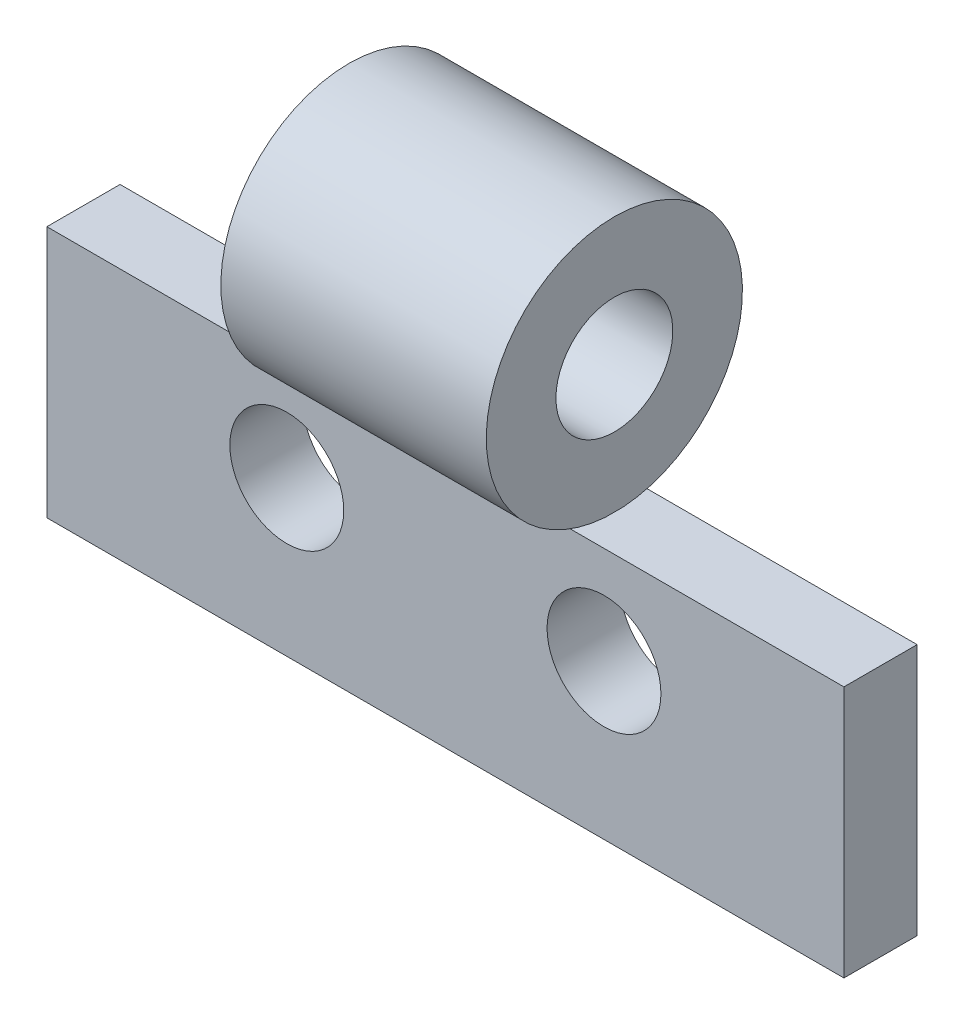
ISO-10303-21;
HEADER;
FILE_DESCRIPTION(('STEP AP214'),'2;1');
FILE_NAME('part.step','',(''),(''),'','','');
FILE_SCHEMA(('AUTOMOTIVE_DESIGN { 1 0 10303 214 1 1 1 1 }'));
ENDSEC;
DATA;
#1=APPLICATION_CONTEXT('core data for automotive mechanical design processes');
#2=APPLICATION_PROTOCOL_DEFINITION('international standard','automotive_design',2000,#1);
#3=PRODUCT_CONTEXT('',#1,'mechanical');
#4=PRODUCT('Part','Part','',(#3));
#5=PRODUCT_RELATED_PRODUCT_CATEGORY('part','',(#4));
#6=PRODUCT_DEFINITION_FORMATION('','',#4);
#7=PRODUCT_DEFINITION_CONTEXT('part definition',#1,'design');
#8=PRODUCT_DEFINITION('design','',#6,#7);
#9=PRODUCT_DEFINITION_SHAPE('','',#8);
#10=(LENGTH_UNIT() NAMED_UNIT(*) SI_UNIT(.MILLI.,.METRE.));
#11=(NAMED_UNIT(*) PLANE_ANGLE_UNIT() SI_UNIT($,.RADIAN.));
#12=(NAMED_UNIT(*) SI_UNIT($,.STERADIAN.) SOLID_ANGLE_UNIT());
#13=UNCERTAINTY_MEASURE_WITH_UNIT(LENGTH_MEASURE(1.E-05),#10,'distance_accuracy_value','');
#14=(GEOMETRIC_REPRESENTATION_CONTEXT(3) GLOBAL_UNCERTAINTY_ASSIGNED_CONTEXT((#13)) GLOBAL_UNIT_ASSIGNED_CONTEXT((#10,
#11,#12)) REPRESENTATION_CONTEXT('',''));
#15=CARTESIAN_POINT('',(0.,0.,0.));
#16=DIRECTION('',(0.,0.,1.));
#17=DIRECTION('',(1.,0.,0.));
#18=AXIS2_PLACEMENT_3D('',#15,#16,#17);
#19=CARTESIAN_POINT('',(-24.27796875,7.59378125,2.286));
#20=DIRECTION('',(1.,0.,0.));
#21=DIRECTION('',(0.,0.,-1.));
#22=AXIS2_PLACEMENT_3D('',#19,#20,#21);
#23=PLANE('',#22);
#24=DIRECTION('',(0.,0.,-1.));
#25=VECTOR('',#24,1.);
#26=CARTESIAN_POINT('',(-24.27796875,7.59378125,2.286));
#27=LINE('',#26,#25);
#28=CARTESIAN_POINT('',(-24.27796875,7.59378125,2.286));
#29=VERTEX_POINT('',#28);
#30=CARTESIAN_POINT('',(-24.27796875,7.59378125,0.));
#31=VERTEX_POINT('',#30);
#32=EDGE_CURVE('E55',#29,#31,#27,.T.);
#33=ORIENTED_EDGE('',*,*,#32,.T.);
#34=DIRECTION('',(0.,-1.,0.));
#35=VECTOR('',#34,1.);
#36=CARTESIAN_POINT('',(-24.27796875,7.59378125,0.));
#37=LINE('',#36,#35);
#38=CARTESIAN_POINT('',(-24.27796875,-0.28021875,0.));
#39=VERTEX_POINT('',#38);
#40=EDGE_CURVE('E108',#31,#39,#37,.T.);
#41=ORIENTED_EDGE('',*,*,#40,.T.);
#42=DIRECTION('',(0.,0.,-1.));
#43=VECTOR('',#42,1.);
#44=CARTESIAN_POINT('',(-24.27796875,-0.28021875,2.286));
#45=LINE('',#44,#43);
#46=CARTESIAN_POINT('',(-24.27796875,-0.28021875,2.286));
#47=VERTEX_POINT('',#46);
#48=EDGE_CURVE('E136',#47,#39,#45,.T.);
#49=ORIENTED_EDGE('',*,*,#48,.F.);
#50=DIRECTION('',(0.,-1.,0.));
#51=VECTOR('',#50,1.);
#52=CARTESIAN_POINT('',(-24.27796875,7.59378125,2.286));
#53=LINE('',#52,#51);
#54=EDGE_CURVE('E115',#29,#47,#53,.T.);
#55=ORIENTED_EDGE('',*,*,#54,.F.);
#56=EDGE_LOOP('',(#33,#41,#49,#55));
#57=FACE_BOUND('',#56,.T.);
#58=ADVANCED_FACE('F32',(#57),#23,.F.);
#59=CARTESIAN_POINT('',(-24.27796875,-0.28021875,2.286));
#60=DIRECTION('',(0.,1.,0.));
#61=DIRECTION('',(0.,0.,1.));
#62=AXIS2_PLACEMENT_3D('',#59,#60,#61);
#63=PLANE('',#62);
#64=DIRECTION('',(1.,0.,0.));
#65=VECTOR('',#64,1.);
#66=CARTESIAN_POINT('',(-24.27796875,-0.28021875,0.));
#67=LINE('',#66,#65);
#68=CARTESIAN_POINT('',(0.61403125,-0.28021875,0.));
#69=VERTEX_POINT('',#68);
#70=EDGE_CURVE('E110',#39,#69,#67,.T.);
#71=ORIENTED_EDGE('',*,*,#70,.T.);
#72=DIRECTION('',(0.,0.,-1.));
#73=VECTOR('',#72,1.);
#74=CARTESIAN_POINT('',(0.61403125,-0.28021875,2.286));
#75=LINE('',#74,#73);
#76=CARTESIAN_POINT('',(0.61403125,-0.28021875,2.286));
#77=VERTEX_POINT('',#76);
#78=EDGE_CURVE('E134',#77,#69,#75,.T.);
#79=ORIENTED_EDGE('',*,*,#78,.F.);
#80=DIRECTION('',(1.,0.,0.));
#81=VECTOR('',#80,1.);
#82=CARTESIAN_POINT('',(-24.27796875,-0.28021875,2.286));
#83=LINE('',#82,#81);
#84=EDGE_CURVE('E81',#47,#77,#83,.T.);
#85=ORIENTED_EDGE('',*,*,#84,.F.);
#86=ORIENTED_EDGE('',*,*,#48,.T.);
#87=EDGE_LOOP('',(#71,#79,#85,#86));
#88=FACE_BOUND('',#87,.T.);
#89=ADVANCED_FACE('F154',(#88),#63,.F.);
#90=CARTESIAN_POINT('',(0.614031249999999,7.59378125,2.286));
#91=DIRECTION('',(1.,0.,0.));
#92=DIRECTION('',(0.,1.,0.));
#93=AXIS2_PLACEMENT_3D('',#90,#91,#92);
#94=PLANE('',#93);
#95=DIRECTION('',(0.,-1.,0.));
#96=VECTOR('',#95,1.);
#97=CARTESIAN_POINT('',(0.614031249999999,7.59378125,0.));
#98=LINE('',#97,#96);
#99=CARTESIAN_POINT('',(0.614031249999999,7.59378125,0.));
#100=VERTEX_POINT('',#99);
#101=EDGE_CURVE('E126',#100,#69,#98,.T.);
#102=ORIENTED_EDGE('',*,*,#101,.F.);
#103=DIRECTION('',(0.,0.,-1.));
#104=VECTOR('',#103,1.);
#105=CARTESIAN_POINT('',(0.614031249999999,7.59378125,2.286));
#106=LINE('',#105,#104);
#107=CARTESIAN_POINT('',(0.614031249999999,7.59378125,2.286));
#108=VERTEX_POINT('',#107);
#109=EDGE_CURVE('E131',#108,#100,#106,.T.);
#110=ORIENTED_EDGE('',*,*,#109,.F.);
#111=DIRECTION('',(0.,-1.,0.));
#112=VECTOR('',#111,1.);
#113=CARTESIAN_POINT('',(0.614031249999999,7.59378125,2.286));
#114=LINE('',#113,#112);
#115=EDGE_CURVE('E119',#108,#77,#114,.T.);
#116=ORIENTED_EDGE('',*,*,#115,.T.);
#117=ORIENTED_EDGE('',*,*,#78,.T.);
#118=EDGE_LOOP('',(#102,#110,#116,#117));
#119=FACE_BOUND('',#118,.T.);
#120=ADVANCED_FACE('F158',(#119),#94,.T.);
#121=CARTESIAN_POINT('',(-24.27796875,7.59378125,2.286));
#122=DIRECTION('',(0.,1.,0.));
#123=DIRECTION('',(-1.,0.,0.));
#124=AXIS2_PLACEMENT_3D('',#121,#122,#123);
#125=PLANE('',#124);
#126=DIRECTION('',(-1.,0.,0.));
#127=VECTOR('',#126,1.);
#128=CARTESIAN_POINT('',(-7.69796875,7.59378125,1.42566588050203));
#129=LINE('',#128,#127);
#130=CARTESIAN_POINT('',(-15.98796875,7.59378125,1.42566588050203));
#131=VERTEX_POINT('',#130);
#132=CARTESIAN_POINT('',(-7.69796875,7.59378125,1.42566588050203));
#133=VERTEX_POINT('',#132);
#134=EDGE_CURVE('E40',#131,#133,#129,.F.);
#135=ORIENTED_EDGE('',*,*,#134,.F.);
#136=DIRECTION('',(0.,0.,-1.));
#137=VECTOR('',#136,1.);
#138=CARTESIAN_POINT('',(-15.98796875,7.59378125,9.57083423816485));
#139=LINE('',#138,#137);
#140=CARTESIAN_POINT('',(-15.98796875,7.59378125,0.860334119497956));
#141=VERTEX_POINT('',#140);
#142=EDGE_CURVE('E46',#131,#141,#139,.T.);
#143=ORIENTED_EDGE('',*,*,#142,.T.);
#144=DIRECTION('',(-1.,0.,0.));
#145=VECTOR('',#144,1.);
#146=CARTESIAN_POINT('',(-7.69796875,7.59378125,0.860334119497968));
#147=LINE('',#146,#145);
#148=CARTESIAN_POINT('',(-7.69796875,7.59378125,0.860334119497968));
#149=VERTEX_POINT('',#148);
#150=EDGE_CURVE('E11',#149,#141,#147,.T.);
#151=ORIENTED_EDGE('',*,*,#150,.F.);
#152=DIRECTION('',(0.,0.,1.));
#153=VECTOR('',#152,1.);
#154=CARTESIAN_POINT('',(-7.69796875,7.59378125,2.286));
#155=LINE('',#154,#153);
#156=EDGE_CURVE('E138',#149,#133,#155,.T.);
#157=ORIENTED_EDGE('',*,*,#156,.T.);
#158=EDGE_LOOP('',(#135,#143,#151,#157));
#159=FACE_BOUND('',#158,.T.);
#160=DIRECTION('',(1.,0.,0.));
#161=VECTOR('',#160,1.);
#162=CARTESIAN_POINT('',(-24.27796875,7.59378125,2.286));
#163=LINE('',#162,#161);
#164=EDGE_CURVE('E122',#29,#108,#163,.T.);
#165=ORIENTED_EDGE('',*,*,#164,.T.);
#166=ORIENTED_EDGE('',*,*,#109,.T.);
#167=DIRECTION('',(1.,0.,0.));
#168=VECTOR('',#167,1.);
#169=CARTESIAN_POINT('',(-24.27796875,7.59378125,0.));
#170=LINE('',#169,#168);
#171=EDGE_CURVE('E117',#31,#100,#170,.T.);
#172=ORIENTED_EDGE('',*,*,#171,.F.);
#173=ORIENTED_EDGE('',*,*,#32,.F.);
#174=EDGE_LOOP('',(#165,#166,#172,#173));
#175=FACE_BOUND('',#174,.T.);
#176=ADVANCED_FACE('F99',(#159,#175),#125,.T.);
#177=CARTESIAN_POINT('',(0.,0.,2.286));
#178=DIRECTION('',(0.,0.,1.));
#179=DIRECTION('',(1.,0.,0.));
#180=AXIS2_PLACEMENT_3D('',#177,#178,#179);
#181=PLANE('',#180);
#182=CARTESIAN_POINT('',(-16.78496875,4.54578125,2.286));
#183=DIRECTION('',(0.,0.,1.));
#184=DIRECTION('',(1.,0.,0.));
#185=AXIS2_PLACEMENT_3D('',#182,#183,#184);
#186=CIRCLE('',#185,1.778);
#187=CARTESIAN_POINT('',(-15.00696875,4.54578125,2.286));
#188=VERTEX_POINT('',#187);
#189=EDGE_CURVE('E178',#188,#188,#186,.T.);
#190=ORIENTED_EDGE('',*,*,#189,.F.);
#191=EDGE_LOOP('',(#190));
#192=FACE_BOUND('',#191,.T.);
#193=CARTESIAN_POINT('',(-6.87896875,4.54578125,2.286));
#194=DIRECTION('',(0.,0.,1.));
#195=DIRECTION('',(1.,0.,0.));
#196=AXIS2_PLACEMENT_3D('',#193,#194,#195);
#197=CIRCLE('',#196,1.778);
#198=CARTESIAN_POINT('',(-5.10096875,4.54578125,2.286));
#199=VERTEX_POINT('',#198);
#200=EDGE_CURVE('E101',#199,#199,#197,.T.);
#201=ORIENTED_EDGE('',*,*,#200,.F.);
#202=EDGE_LOOP('',(#201));
#203=FACE_BOUND('',#202,.T.);
#204=ORIENTED_EDGE('',*,*,#54,.T.);
#205=ORIENTED_EDGE('',*,*,#84,.T.);
#206=ORIENTED_EDGE('',*,*,#115,.F.);
#207=ORIENTED_EDGE('',*,*,#164,.F.);
#208=EDGE_LOOP('',(#204,#205,#206,#207));
#209=FACE_BOUND('',#208,.T.);
#210=ADVANCED_FACE('F167',(#192,#203,#209),#181,.T.);
#211=CARTESIAN_POINT('',(0.,0.,0.));
#212=DIRECTION('',(0.,0.,1.));
#213=DIRECTION('',(1.,0.,0.));
#214=AXIS2_PLACEMENT_3D('',#211,#212,#213);
#215=PLANE('',#214);
#216=CARTESIAN_POINT('',(-16.78496875,4.54578125,0.));
#217=DIRECTION('',(0.,0.,-1.));
#218=DIRECTION('',(-1.,0.,0.));
#219=AXIS2_PLACEMENT_3D('',#216,#217,#218);
#220=CIRCLE('',#219,1.778);
#221=CARTESIAN_POINT('',(-18.56296875,4.54578125,0.));
#222=VERTEX_POINT('',#221);
#223=EDGE_CURVE('E195',#222,#222,#220,.T.);
#224=ORIENTED_EDGE('',*,*,#223,.F.);
#225=EDGE_LOOP('',(#224));
#226=FACE_BOUND('',#225,.T.);
#227=CARTESIAN_POINT('',(-6.87896875,4.54578125,0.));
#228=DIRECTION('',(0.,0.,-1.));
#229=DIRECTION('',(-1.,0.,0.));
#230=AXIS2_PLACEMENT_3D('',#227,#228,#229);
#231=CIRCLE('',#230,1.778);
#232=CARTESIAN_POINT('',(-8.65696875,4.54578125,0.));
#233=VERTEX_POINT('',#232);
#234=EDGE_CURVE('E189',#233,#233,#231,.T.);
#235=ORIENTED_EDGE('',*,*,#234,.F.);
#236=EDGE_LOOP('',(#235));
#237=FACE_BOUND('',#236,.T.);
#238=ORIENTED_EDGE('',*,*,#40,.F.);
#239=ORIENTED_EDGE('',*,*,#171,.T.);
#240=ORIENTED_EDGE('',*,*,#101,.T.);
#241=ORIENTED_EDGE('',*,*,#70,.F.);
#242=EDGE_LOOP('',(#238,#239,#240,#241));
#243=FACE_BOUND('',#242,.T.);
#244=ADVANCED_FACE('F151',(#226,#237,#243),#215,.F.);
#245=CARTESIAN_POINT('',(-7.69796875,11.58378125,1.143));
#246=DIRECTION('',(-1.,0.,0.));
#247=DIRECTION('',(0.,0.,1.));
#248=AXIS2_PLACEMENT_3D('',#245,#246,#247);
#249=CYLINDRICAL_SURFACE('',#248,4.);
#250=CARTESIAN_POINT('',(-15.98796875,11.58378125,1.143));
#251=DIRECTION('',(1.,0.,0.));
#252=DIRECTION('',(0.,0.,-1.));
#253=AXIS2_PLACEMENT_3D('',#250,#251,#252);
#254=CIRCLE('',#253,4.);
#255=EDGE_CURVE('E90',#131,#141,#254,.F.);
#256=ORIENTED_EDGE('',*,*,#255,.F.);
#257=ORIENTED_EDGE('',*,*,#134,.T.);
#258=CARTESIAN_POINT('',(-7.69796875,11.58378125,1.143));
#259=DIRECTION('',(-1.,0.,0.));
#260=DIRECTION('',(0.,0.,1.));
#261=AXIS2_PLACEMENT_3D('',#258,#259,#260);
#262=CIRCLE('',#261,4.);
#263=EDGE_CURVE('E106',#133,#149,#262,.T.);
#264=ORIENTED_EDGE('',*,*,#263,.T.);
#265=ORIENTED_EDGE('',*,*,#150,.T.);
#266=EDGE_LOOP('',(#256,#257,#264,#265));
#267=FACE_BOUND('',#266,.T.);
#268=ADVANCED_FACE('F104',(#267),#249,.T.);
#269=CARTESIAN_POINT('',(-7.69796875,11.58378125,1.143));
#270=DIRECTION('',(-1.,0.,0.));
#271=DIRECTION('',(0.,0.,1.));
#272=AXIS2_PLACEMENT_3D('',#269,#270,#271);
#273=PLANE('',#272);
#274=CARTESIAN_POINT('',(-7.69796875,11.58378125,1.143));
#275=DIRECTION('',(-1.,0.,0.));
#276=DIRECTION('',(0.,0.,1.));
#277=AXIS2_PLACEMENT_3D('',#274,#275,#276);
#278=CIRCLE('',#277,1.825);
#279=CARTESIAN_POINT('',(-7.69796875,11.58378125,2.968));
#280=VERTEX_POINT('',#279);
#281=EDGE_CURVE('E95',#280,#280,#278,.T.);
#282=ORIENTED_EDGE('',*,*,#281,.T.);
#283=EDGE_LOOP('',(#282));
#284=FACE_BOUND('',#283,.T.);
#285=ORIENTED_EDGE('',*,*,#156,.F.);
#286=ORIENTED_EDGE('',*,*,#263,.F.);
#287=EDGE_LOOP('',(#285,#286));
#288=FACE_BOUND('',#287,.T.);
#289=ADVANCED_FACE('F140',(#284,#288),#273,.F.);
#290=CARTESIAN_POINT('',(-7.69796875,11.58378125,1.143));
#291=DIRECTION('',(-1.,0.,0.));
#292=DIRECTION('',(0.,0.,1.));
#293=AXIS2_PLACEMENT_3D('',#290,#291,#292);
#294=CYLINDRICAL_SURFACE('',#293,1.825);
#295=CARTESIAN_POINT('',(-15.98796875,11.58378125,1.143));
#296=DIRECTION('',(1.,0.,0.));
#297=DIRECTION('',(0.,0.,-1.));
#298=AXIS2_PLACEMENT_3D('',#295,#296,#297);
#299=CIRCLE('',#298,1.825);
#300=CARTESIAN_POINT('',(-15.98796875,11.58378125,-0.682));
#301=VERTEX_POINT('',#300);
#302=EDGE_CURVE('E35',#301,#301,#299,.F.);
#303=ORIENTED_EDGE('',*,*,#302,.T.);
#304=EDGE_LOOP('',(#303));
#305=FACE_BOUND('',#304,.T.);
#306=ORIENTED_EDGE('',*,*,#281,.F.);
#307=EDGE_LOOP('',(#306));
#308=FACE_BOUND('',#307,.T.);
#309=ADVANCED_FACE('F142',(#305,#308),#294,.F.);
#310=CARTESIAN_POINT('',(-15.98796875,0.,0.));
#311=DIRECTION('',(1.,0.,0.));
#312=DIRECTION('',(0.,0.,-1.));
#313=AXIS2_PLACEMENT_3D('',#310,#311,#312);
#314=PLANE('',#313);
#315=ORIENTED_EDGE('',*,*,#255,.T.);
#316=ORIENTED_EDGE('',*,*,#142,.F.);
#317=EDGE_LOOP('',(#315,#316));
#318=FACE_BOUND('',#317,.T.);
#319=ORIENTED_EDGE('',*,*,#302,.F.);
#320=EDGE_LOOP('',(#319));
#321=FACE_BOUND('',#320,.T.);
#322=ADVANCED_FACE('F91',(#318,#321),#314,.F.);
#323=CARTESIAN_POINT('',(-6.87896875,4.54578125,8.29));
#324=DIRECTION('',(0.,0.,-1.));
#325=DIRECTION('',(-1.,0.,0.));
#326=AXIS2_PLACEMENT_3D('',#323,#324,#325);
#327=CYLINDRICAL_SURFACE('',#326,1.778);
#328=ORIENTED_EDGE('',*,*,#200,.T.);
#329=EDGE_LOOP('',(#328));
#330=FACE_BOUND('',#329,.T.);
#331=ORIENTED_EDGE('',*,*,#234,.T.);
#332=EDGE_LOOP('',(#331));
#333=FACE_BOUND('',#332,.T.);
#334=ADVANCED_FACE('F203',(#330,#333),#327,.F.);
#335=CARTESIAN_POINT('',(-16.78496875,4.54578125,8.29));
#336=DIRECTION('',(0.,0.,-1.));
#337=DIRECTION('',(-1.,0.,0.));
#338=AXIS2_PLACEMENT_3D('',#335,#336,#337);
#339=CYLINDRICAL_SURFACE('',#338,1.778);
#340=ORIENTED_EDGE('',*,*,#189,.T.);
#341=EDGE_LOOP('',(#340));
#342=FACE_BOUND('',#341,.T.);
#343=ORIENTED_EDGE('',*,*,#223,.T.);
#344=EDGE_LOOP('',(#343));
#345=FACE_BOUND('',#344,.T.);
#346=ADVANCED_FACE('F199',(#342,#345),#339,.F.);
#347=CLOSED_SHELL('',(#58,#89,#120,#176,#210,#244,#268,#289,#309,#322,#334,#346));
#348=MANIFOLD_SOLID_BREP('B2',#347);
#349=ADVANCED_BREP_SHAPE_REPRESENTATION('',(#18,#348),#14);
#350=SHAPE_DEFINITION_REPRESENTATION(#9,#349);
ENDSEC;
END-ISO-10303-21;
